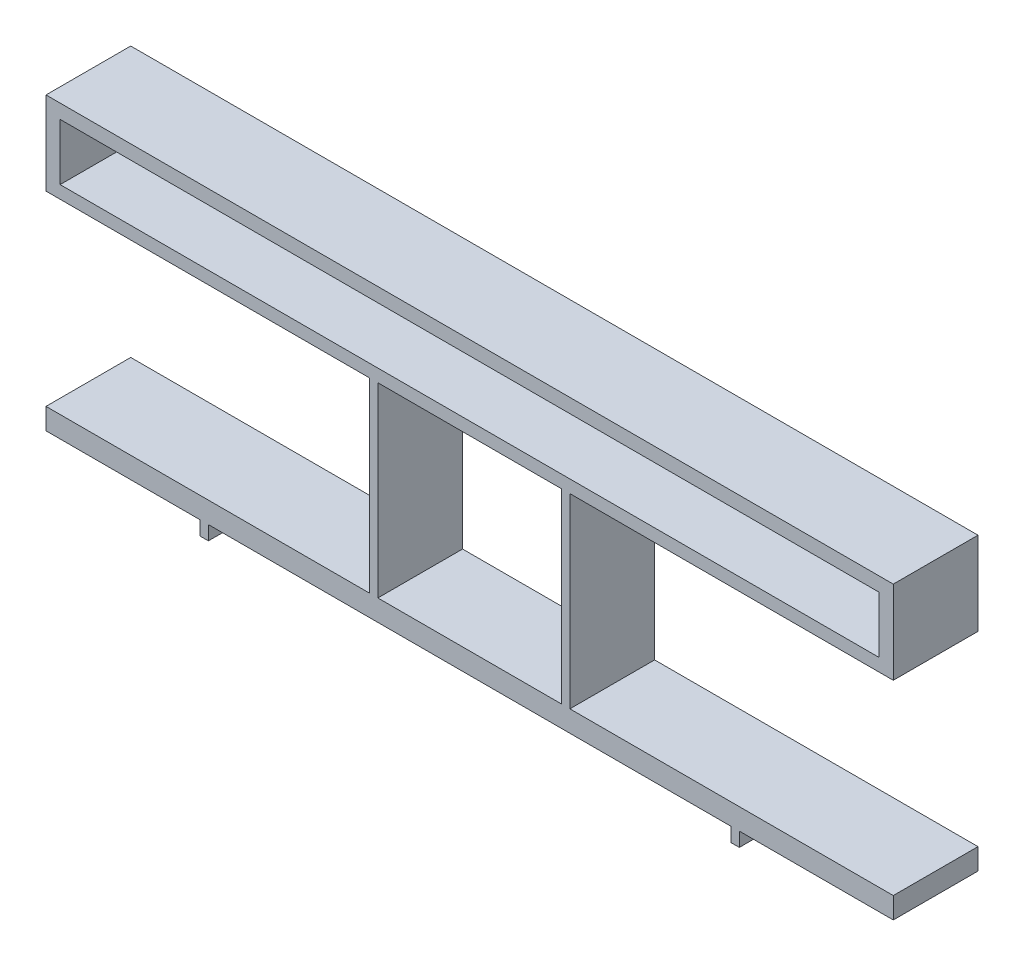
ISO-10303-21;
HEADER;
FILE_DESCRIPTION(('STEP AP214'),'2;1');
FILE_NAME('part.step','',(''),(''),'','','');
FILE_SCHEMA(('AUTOMOTIVE_DESIGN { 1 0 10303 214 1 1 1 1 }'));
ENDSEC;
DATA;
#1=APPLICATION_CONTEXT('core data for automotive mechanical design processes');
#2=APPLICATION_PROTOCOL_DEFINITION('international standard','automotive_design',2000,#1);
#3=PRODUCT_CONTEXT('',#1,'mechanical');
#4=PRODUCT('Part','Part','',(#3));
#5=PRODUCT_RELATED_PRODUCT_CATEGORY('part','',(#4));
#6=PRODUCT_DEFINITION_FORMATION('','',#4);
#7=PRODUCT_DEFINITION_CONTEXT('part definition',#1,'design');
#8=PRODUCT_DEFINITION('design','',#6,#7);
#9=PRODUCT_DEFINITION_SHAPE('','',#8);
#10=(LENGTH_UNIT() NAMED_UNIT(*) SI_UNIT(.MILLI.,.METRE.));
#11=(NAMED_UNIT(*) PLANE_ANGLE_UNIT() SI_UNIT($,.RADIAN.));
#12=(NAMED_UNIT(*) SI_UNIT($,.STERADIAN.) SOLID_ANGLE_UNIT());
#13=UNCERTAINTY_MEASURE_WITH_UNIT(LENGTH_MEASURE(1.E-05),#10,'distance_accuracy_value','');
#14=(GEOMETRIC_REPRESENTATION_CONTEXT(3) GLOBAL_UNCERTAINTY_ASSIGNED_CONTEXT((#13)) GLOBAL_UNIT_ASSIGNED_CONTEXT((#10,
#11,#12)) REPRESENTATION_CONTEXT('',''));
#15=CARTESIAN_POINT('',(0.,0.,0.));
#16=DIRECTION('',(0.,0.,1.));
#17=DIRECTION('',(1.,0.,0.));
#18=AXIS2_PLACEMENT_3D('',#15,#16,#17);
#19=CARTESIAN_POINT('',(-12.2386363636364,3.1875,30.));
#20=DIRECTION('',(0.,-1.,0.));
#21=DIRECTION('',(0.,0.,-1.));
#22=AXIS2_PLACEMENT_3D('',#19,#20,#21);
#23=PLANE('',#22);
#24=DIRECTION('',(0.,0.,1.));
#25=VECTOR('',#24,1.);
#26=CARTESIAN_POINT('',(102.261363636364,3.1875,0.));
#27=LINE('',#26,#25);
#28=CARTESIAN_POINT('',(102.261363636364,3.1875,0.));
#29=VERTEX_POINT('',#28);
#30=CARTESIAN_POINT('',(102.261363636364,3.1875,30.));
#31=VERTEX_POINT('',#30);
#32=EDGE_CURVE('E323',#29,#31,#27,.T.);
#33=ORIENTED_EDGE('',*,*,#32,.F.);
#34=DIRECTION('',(-1.,0.,0.));
#35=VECTOR('',#34,1.);
#36=CARTESIAN_POINT('',(-12.2386363636364,3.1875,0.));
#37=LINE('',#36,#35);
#38=CARTESIAN_POINT('',(-12.2386363636364,3.1875,0.));
#39=VERTEX_POINT('',#38);
#40=EDGE_CURVE('E494',#29,#39,#37,.T.);
#41=ORIENTED_EDGE('',*,*,#40,.T.);
#42=DIRECTION('',(0.,0.,-1.));
#43=VECTOR('',#42,1.);
#44=CARTESIAN_POINT('',(-12.2386363636364,3.1875,30.));
#45=LINE('',#44,#43);
#46=CARTESIAN_POINT('',(-12.2386363636364,3.1875,30.));
#47=VERTEX_POINT('',#46);
#48=EDGE_CURVE('E481',#47,#39,#45,.T.);
#49=ORIENTED_EDGE('',*,*,#48,.F.);
#50=DIRECTION('',(-1.,0.,0.));
#51=VECTOR('',#50,1.);
#52=CARTESIAN_POINT('',(-12.2386363636364,3.1875,30.));
#53=LINE('',#52,#51);
#54=EDGE_CURVE('E476',#31,#47,#53,.T.);
#55=ORIENTED_EDGE('',*,*,#54,.F.);
#56=EDGE_LOOP('',(#33,#41,#49,#55));
#57=FACE_BOUND('',#56,.T.);
#58=ADVANCED_FACE('F41',(#57),#23,.F.);
#59=DIRECTION('',(0.,0.,-1.));
#60=VECTOR('',#59,1.);
#61=CARTESIAN_POINT('',(105.261363636364,3.1875,0.));
#62=LINE('',#61,#60);
#63=CARTESIAN_POINT('',(105.261363636364,3.1875,30.));
#64=VERTEX_POINT('',#63);
#65=CARTESIAN_POINT('',(105.261363636364,3.1875,0.));
#66=VERTEX_POINT('',#65);
#67=EDGE_CURVE('E329',#64,#66,#62,.T.);
#68=ORIENTED_EDGE('',*,*,#67,.F.);
#69=CARTESIAN_POINT('',(170.261363636364,3.1875,30.));
#70=VERTEX_POINT('',#69);
#71=EDGE_CURVE('E482',#70,#64,#53,.T.);
#72=ORIENTED_EDGE('',*,*,#71,.F.);
#73=DIRECTION('',(0.,0.,1.));
#74=VECTOR('',#73,1.);
#75=CARTESIAN_POINT('',(170.261363636364,3.1875,0.));
#76=LINE('',#75,#74);
#77=CARTESIAN_POINT('',(170.261363636364,3.1875,0.));
#78=VERTEX_POINT('',#77);
#79=EDGE_CURVE('E355',#78,#70,#76,.T.);
#80=ORIENTED_EDGE('',*,*,#79,.F.);
#81=EDGE_CURVE('E497',#78,#66,#37,.T.);
#82=ORIENTED_EDGE('',*,*,#81,.T.);
#83=EDGE_LOOP('',(#68,#72,#80,#82));
#84=FACE_BOUND('',#83,.T.);
#85=ADVANCED_FACE('F554',(#84),#23,.F.);
#86=DIRECTION('',(0.,0.,-1.));
#87=VECTOR('',#86,1.);
#88=CARTESIAN_POINT('',(173.261363636364,3.1875,0.));
#89=LINE('',#88,#87);
#90=CARTESIAN_POINT('',(173.261363636364,3.1875,30.));
#91=VERTEX_POINT('',#90);
#92=CARTESIAN_POINT('',(173.261363636364,3.1875,0.));
#93=VERTEX_POINT('',#92);
#94=EDGE_CURVE('E361',#91,#93,#89,.T.);
#95=ORIENTED_EDGE('',*,*,#94,.F.);
#96=CARTESIAN_POINT('',(287.761363636364,3.1875,30.));
#97=VERTEX_POINT('',#96);
#98=EDGE_CURVE('E477',#97,#91,#53,.T.);
#99=ORIENTED_EDGE('',*,*,#98,.F.);
#100=DIRECTION('',(0.,0.,-1.));
#101=VECTOR('',#100,1.);
#102=CARTESIAN_POINT('',(287.761363636364,3.1875,30.));
#103=LINE('',#102,#101);
#104=CARTESIAN_POINT('',(287.761363636364,3.1875,0.));
#105=VERTEX_POINT('',#104);
#106=EDGE_CURVE('E501',#97,#105,#103,.T.);
#107=ORIENTED_EDGE('',*,*,#106,.T.);
#108=EDGE_CURVE('E467',#105,#93,#37,.T.);
#109=ORIENTED_EDGE('',*,*,#108,.T.);
#110=EDGE_LOOP('',(#95,#99,#107,#109));
#111=FACE_BOUND('',#110,.T.);
#112=ADVANCED_FACE('F520',(#111),#23,.F.);
#113=CARTESIAN_POINT('',(-12.2386363636364,-4.3125,30.));
#114=DIRECTION('',(0.,1.,0.));
#115=DIRECTION('',(0.,0.,1.));
#116=AXIS2_PLACEMENT_3D('',#113,#114,#115);
#117=PLANE('',#116);
#118=DIRECTION('',(0.,0.,1.));
#119=VECTOR('',#118,1.);
#120=CARTESIAN_POINT('',(45.2613636363636,-4.3125,0.));
#121=LINE('',#120,#119);
#122=CARTESIAN_POINT('',(45.2613636363636,-4.3125,0.));
#123=VERTEX_POINT('',#122);
#124=CARTESIAN_POINT('',(45.2613636363636,-4.3125,30.));
#125=VERTEX_POINT('',#124);
#126=EDGE_CURVE('E387',#123,#125,#121,.T.);
#127=ORIENTED_EDGE('',*,*,#126,.F.);
#128=DIRECTION('',(1.,0.,0.));
#129=VECTOR('',#128,1.);
#130=CARTESIAN_POINT('',(-12.2386363636364,-4.3125,0.));
#131=LINE('',#130,#129);
#132=CARTESIAN_POINT('',(230.261363636364,-4.3125,0.));
#133=VERTEX_POINT('',#132);
#134=EDGE_CURVE('E491',#123,#133,#131,.T.);
#135=ORIENTED_EDGE('',*,*,#134,.T.);
#136=DIRECTION('',(0.,0.,-1.));
#137=VECTOR('',#136,1.);
#138=CARTESIAN_POINT('',(230.261363636364,-4.3125,0.));
#139=LINE('',#138,#137);
#140=CARTESIAN_POINT('',(230.261363636364,-4.3125,30.));
#141=VERTEX_POINT('',#140);
#142=EDGE_CURVE('E430',#141,#133,#139,.T.);
#143=ORIENTED_EDGE('',*,*,#142,.F.);
#144=DIRECTION('',(1.,0.,0.));
#145=VECTOR('',#144,1.);
#146=CARTESIAN_POINT('',(-12.2386363636364,-4.3125,30.));
#147=LINE('',#146,#145);
#148=EDGE_CURVE('E473',#125,#141,#147,.T.);
#149=ORIENTED_EDGE('',*,*,#148,.F.);
#150=EDGE_LOOP('',(#127,#135,#143,#149));
#151=FACE_BOUND('',#150,.T.);
#152=ADVANCED_FACE('F537',(#151),#117,.F.);
#153=DIRECTION('',(0.,0.,-1.));
#154=VECTOR('',#153,1.);
#155=CARTESIAN_POINT('',(42.2613636363636,-4.3125,0.));
#156=LINE('',#155,#154);
#157=CARTESIAN_POINT('',(42.2613636363636,-4.3125,30.));
#158=VERTEX_POINT('',#157);
#159=CARTESIAN_POINT('',(42.2613636363636,-4.3125,0.));
#160=VERTEX_POINT('',#159);
#161=EDGE_CURVE('E393',#158,#160,#156,.T.);
#162=ORIENTED_EDGE('',*,*,#161,.F.);
#163=CARTESIAN_POINT('',(-12.2386363636364,-4.3125,30.));
#164=VERTEX_POINT('',#163);
#165=EDGE_CURVE('E468',#164,#158,#147,.T.);
#166=ORIENTED_EDGE('',*,*,#165,.F.);
#167=DIRECTION('',(0.,0.,-1.));
#168=VECTOR('',#167,1.);
#169=CARTESIAN_POINT('',(-12.2386363636364,-4.3125,30.));
#170=LINE('',#169,#168);
#171=CARTESIAN_POINT('',(-12.2386363636364,-4.3125,0.));
#172=VERTEX_POINT('',#171);
#173=EDGE_CURVE('E11',#164,#172,#170,.T.);
#174=ORIENTED_EDGE('',*,*,#173,.T.);
#175=EDGE_CURVE('E487',#172,#160,#131,.T.);
#176=ORIENTED_EDGE('',*,*,#175,.T.);
#177=EDGE_LOOP('',(#162,#166,#174,#176));
#178=FACE_BOUND('',#177,.T.);
#179=ADVANCED_FACE('F620',(#178),#117,.F.);
#180=DIRECTION('',(0.,0.,1.));
#181=VECTOR('',#180,1.);
#182=CARTESIAN_POINT('',(233.261363636364,-4.3125,0.));
#183=LINE('',#182,#181);
#184=CARTESIAN_POINT('',(233.261363636364,-4.3125,0.));
#185=VERTEX_POINT('',#184);
#186=CARTESIAN_POINT('',(233.261363636364,-4.3125,30.));
#187=VERTEX_POINT('',#186);
#188=EDGE_CURVE('E424',#185,#187,#183,.T.);
#189=ORIENTED_EDGE('',*,*,#188,.F.);
#190=CARTESIAN_POINT('',(287.761363636364,-4.3125,0.));
#191=VERTEX_POINT('',#190);
#192=EDGE_CURVE('E486',#185,#191,#131,.T.);
#193=ORIENTED_EDGE('',*,*,#192,.T.);
#194=DIRECTION('',(0.,0.,-1.));
#195=VECTOR('',#194,1.);
#196=CARTESIAN_POINT('',(287.761363636364,-4.3125,30.));
#197=LINE('',#196,#195);
#198=CARTESIAN_POINT('',(287.761363636364,-4.3125,30.));
#199=VERTEX_POINT('',#198);
#200=EDGE_CURVE('E50',#199,#191,#197,.T.);
#201=ORIENTED_EDGE('',*,*,#200,.F.);
#202=EDGE_CURVE('E466',#187,#199,#147,.T.);
#203=ORIENTED_EDGE('',*,*,#202,.F.);
#204=EDGE_LOOP('',(#189,#193,#201,#203));
#205=FACE_BOUND('',#204,.T.);
#206=ADVANCED_FACE('F547',(#205),#117,.F.);
#207=CARTESIAN_POINT('',(-12.2386363636364,3.1875,30.));
#208=DIRECTION('',(1.,0.,0.));
#209=DIRECTION('',(0.,0.,-1.));
#210=AXIS2_PLACEMENT_3D('',#207,#208,#209);
#211=PLANE('',#210);
#212=DIRECTION('',(0.,-1.,0.));
#213=VECTOR('',#212,1.);
#214=CARTESIAN_POINT('',(-12.2386363636364,3.1875,0.));
#215=LINE('',#214,#213);
#216=EDGE_CURVE('E461',#39,#172,#215,.T.);
#217=ORIENTED_EDGE('',*,*,#216,.T.);
#218=ORIENTED_EDGE('',*,*,#173,.F.);
#219=DIRECTION('',(0.,-1.,0.));
#220=VECTOR('',#219,1.);
#221=CARTESIAN_POINT('',(-12.2386363636364,3.1875,30.));
#222=LINE('',#221,#220);
#223=EDGE_CURVE('E462',#47,#164,#222,.T.);
#224=ORIENTED_EDGE('',*,*,#223,.F.);
#225=ORIENTED_EDGE('',*,*,#48,.T.);
#226=EDGE_LOOP('',(#217,#218,#224,#225));
#227=FACE_BOUND('',#226,.T.);
#228=ADVANCED_FACE('F43',(#227),#211,.F.);
#229=CARTESIAN_POINT('',(287.761363636364,3.1875,30.));
#230=DIRECTION('',(-1.,0.,0.));
#231=DIRECTION('',(0.,0.,1.));
#232=AXIS2_PLACEMENT_3D('',#229,#230,#231);
#233=PLANE('',#232);
#234=DIRECTION('',(0.,1.,0.));
#235=VECTOR('',#234,1.);
#236=CARTESIAN_POINT('',(287.761363636364,3.1875,0.));
#237=LINE('',#236,#235);
#238=EDGE_CURVE('E490',#191,#105,#237,.T.);
#239=ORIENTED_EDGE('',*,*,#238,.T.);
#240=ORIENTED_EDGE('',*,*,#106,.F.);
#241=DIRECTION('',(0.,1.,0.));
#242=VECTOR('',#241,1.);
#243=CARTESIAN_POINT('',(287.761363636364,3.1875,30.));
#244=LINE('',#243,#242);
#245=EDGE_CURVE('E472',#199,#97,#244,.T.);
#246=ORIENTED_EDGE('',*,*,#245,.F.);
#247=ORIENTED_EDGE('',*,*,#200,.T.);
#248=EDGE_LOOP('',(#239,#240,#246,#247));
#249=FACE_BOUND('',#248,.T.);
#250=ADVANCED_FACE('F510',(#249),#233,.F.);
#251=CARTESIAN_POINT('',(0.,0.,30.));
#252=DIRECTION('',(0.,0.,1.));
#253=DIRECTION('',(1.,0.,0.));
#254=AXIS2_PLACEMENT_3D('',#251,#252,#253);
#255=PLANE('',#254);
#256=DIRECTION('',(0.,-1.,0.));
#257=VECTOR('',#256,1.);
#258=CARTESIAN_POINT('',(282.761363636364,93.6875,30.));
#259=LINE('',#258,#257);
#260=CARTESIAN_POINT('',(282.761363636364,93.6875,30.));
#261=VERTEX_POINT('',#260);
#262=CARTESIAN_POINT('',(282.761363636364,73.6875,30.));
#263=VERTEX_POINT('',#262);
#264=EDGE_CURVE('E229',#261,#263,#259,.T.);
#265=ORIENTED_EDGE('',*,*,#264,.T.);
#266=DIRECTION('',(-1.,0.,0.));
#267=VECTOR('',#266,1.);
#268=CARTESIAN_POINT('',(282.761363636364,73.6875,30.));
#269=LINE('',#268,#267);
#270=CARTESIAN_POINT('',(-7.23863636363636,73.6875,30.));
#271=VERTEX_POINT('',#270);
#272=EDGE_CURVE('E239',#263,#271,#269,.T.);
#273=ORIENTED_EDGE('',*,*,#272,.T.);
#274=DIRECTION('',(0.,1.,0.));
#275=VECTOR('',#274,1.);
#276=CARTESIAN_POINT('',(-7.23863636363636,93.6875,30.));
#277=LINE('',#276,#275);
#278=CARTESIAN_POINT('',(-7.23863636363636,93.6875,30.));
#279=VERTEX_POINT('',#278);
#280=EDGE_CURVE('E57',#271,#279,#277,.T.);
#281=ORIENTED_EDGE('',*,*,#280,.T.);
#282=DIRECTION('',(1.,0.,0.));
#283=VECTOR('',#282,1.);
#284=CARTESIAN_POINT('',(282.761363636364,93.6875,30.));
#285=LINE('',#284,#283);
#286=EDGE_CURVE('E236',#279,#261,#285,.T.);
#287=ORIENTED_EDGE('',*,*,#286,.T.);
#288=EDGE_LOOP('',(#265,#273,#281,#287));
#289=FACE_BOUND('',#288,.T.);
#290=DIRECTION('',(0.,-1.,0.));
#291=VECTOR('',#290,1.);
#292=CARTESIAN_POINT('',(173.261363636364,69.1875,30.));
#293=LINE('',#292,#291);
#294=CARTESIAN_POINT('',(173.261363636364,69.1875,30.));
#295=VERTEX_POINT('',#294);
#296=EDGE_CURVE('E379',#295,#91,#293,.T.);
#297=ORIENTED_EDGE('',*,*,#296,.F.);
#298=DIRECTION('',(1.,0.,0.));
#299=VECTOR('',#298,1.);
#300=CARTESIAN_POINT('',(-12.2386363636364,69.1875,30.));
#301=LINE('',#300,#299);
#302=CARTESIAN_POINT('',(287.761363636364,69.1875,30.));
#303=VERTEX_POINT('',#302);
#304=EDGE_CURVE('E294',#295,#303,#301,.T.);
#305=ORIENTED_EDGE('',*,*,#304,.T.);
#306=DIRECTION('',(0.,-1.,0.));
#307=VECTOR('',#306,1.);
#308=CARTESIAN_POINT('',(287.761363636364,98.6875,30.));
#309=LINE('',#308,#307);
#310=CARTESIAN_POINT('',(287.761363636364,98.6875,30.));
#311=VERTEX_POINT('',#310);
#312=EDGE_CURVE('E315',#311,#303,#309,.T.);
#313=ORIENTED_EDGE('',*,*,#312,.F.);
#314=DIRECTION('',(1.,0.,0.));
#315=VECTOR('',#314,1.);
#316=CARTESIAN_POINT('',(-12.2386363636364,98.6875,30.));
#317=LINE('',#316,#315);
#318=CARTESIAN_POINT('',(-12.2386363636364,98.6875,30.));
#319=VERTEX_POINT('',#318);
#320=EDGE_CURVE('E280',#319,#311,#317,.T.);
#321=ORIENTED_EDGE('',*,*,#320,.F.);
#322=DIRECTION('',(0.,-1.,0.));
#323=VECTOR('',#322,1.);
#324=CARTESIAN_POINT('',(-12.2386363636364,98.6875,30.));
#325=LINE('',#324,#323);
#326=CARTESIAN_POINT('',(-12.2386363636364,69.1875,30.));
#327=VERTEX_POINT('',#326);
#328=EDGE_CURVE('E319',#319,#327,#325,.T.);
#329=ORIENTED_EDGE('',*,*,#328,.T.);
#330=CARTESIAN_POINT('',(102.261363636364,69.1875,30.));
#331=VERTEX_POINT('',#330);
#332=EDGE_CURVE('E295',#327,#331,#301,.T.);
#333=ORIENTED_EDGE('',*,*,#332,.T.);
#334=DIRECTION('',(0.,-1.,0.));
#335=VECTOR('',#334,1.);
#336=CARTESIAN_POINT('',(102.261363636364,69.1875,30.));
#337=LINE('',#336,#335);
#338=EDGE_CURVE('E351',#331,#31,#337,.T.);
#339=ORIENTED_EDGE('',*,*,#338,.T.);
#340=ORIENTED_EDGE('',*,*,#54,.T.);
#341=ORIENTED_EDGE('',*,*,#223,.T.);
#342=ORIENTED_EDGE('',*,*,#165,.T.);
#343=DIRECTION('',(0.,1.,0.));
#344=VECTOR('',#343,1.);
#345=CARTESIAN_POINT('',(42.2613636363636,-9.3125,30.));
#346=LINE('',#345,#344);
#347=CARTESIAN_POINT('',(42.2613636363636,-9.3125,30.));
#348=VERTEX_POINT('',#347);
#349=EDGE_CURVE('E416',#348,#158,#346,.T.);
#350=ORIENTED_EDGE('',*,*,#349,.F.);
#351=DIRECTION('',(-1.,0.,0.));
#352=VECTOR('',#351,1.);
#353=CARTESIAN_POINT('',(45.2613636363636,-9.3125,30.));
#354=LINE('',#353,#352);
#355=CARTESIAN_POINT('',(45.2613636363636,-9.3125,30.));
#356=VERTEX_POINT('',#355);
#357=EDGE_CURVE('E392',#356,#348,#354,.T.);
#358=ORIENTED_EDGE('',*,*,#357,.F.);
#359=DIRECTION('',(0.,1.,0.));
#360=VECTOR('',#359,1.);
#361=CARTESIAN_POINT('',(45.2613636363636,-9.3125,30.));
#362=LINE('',#361,#360);
#363=EDGE_CURVE('E420',#356,#125,#362,.T.);
#364=ORIENTED_EDGE('',*,*,#363,.T.);
#365=ORIENTED_EDGE('',*,*,#148,.T.);
#366=DIRECTION('',(0.,1.,0.));
#367=VECTOR('',#366,1.);
#368=CARTESIAN_POINT('',(230.261363636364,-9.3125,30.));
#369=LINE('',#368,#367);
#370=CARTESIAN_POINT('',(230.261363636364,-9.3125,30.));
#371=VERTEX_POINT('',#370);
#372=EDGE_CURVE('E453',#371,#141,#369,.T.);
#373=ORIENTED_EDGE('',*,*,#372,.F.);
#374=DIRECTION('',(-1.,0.,0.));
#375=VECTOR('',#374,1.);
#376=CARTESIAN_POINT('',(233.261363636364,-9.3125,30.));
#377=LINE('',#376,#375);
#378=CARTESIAN_POINT('',(233.261363636364,-9.3125,30.));
#379=VERTEX_POINT('',#378);
#380=EDGE_CURVE('E429',#379,#371,#377,.T.);
#381=ORIENTED_EDGE('',*,*,#380,.F.);
#382=DIRECTION('',(0.,1.,0.));
#383=VECTOR('',#382,1.);
#384=CARTESIAN_POINT('',(233.261363636364,-9.3125,30.));
#385=LINE('',#384,#383);
#386=EDGE_CURVE('E457',#379,#187,#385,.T.);
#387=ORIENTED_EDGE('',*,*,#386,.T.);
#388=ORIENTED_EDGE('',*,*,#202,.T.);
#389=ORIENTED_EDGE('',*,*,#245,.T.);
#390=ORIENTED_EDGE('',*,*,#98,.T.);
#391=EDGE_LOOP('',(#297,#305,#313,#321,#329,#333,#339,#340,#341,#342,#350,#358,#364,#365,#373,
#381,#387,#388,#389,#390));
#392=FACE_BOUND('',#391,.T.);
#393=CARTESIAN_POINT('',(105.261363636364,69.1875,30.));
#394=VERTEX_POINT('',#393);
#395=CARTESIAN_POINT('',(170.261363636364,69.1875,30.));
#396=VERTEX_POINT('',#395);
#397=EDGE_CURVE('E300',#394,#396,#301,.T.);
#398=ORIENTED_EDGE('',*,*,#397,.T.);
#399=DIRECTION('',(0.,-1.,0.));
#400=VECTOR('',#399,1.);
#401=CARTESIAN_POINT('',(170.261363636364,69.1875,30.));
#402=LINE('',#401,#400);
#403=EDGE_CURVE('E383',#396,#70,#402,.T.);
#404=ORIENTED_EDGE('',*,*,#403,.T.);
#405=ORIENTED_EDGE('',*,*,#71,.T.);
#406=DIRECTION('',(0.,-1.,0.));
#407=VECTOR('',#406,1.);
#408=CARTESIAN_POINT('',(105.261363636364,69.1875,30.));
#409=LINE('',#408,#407);
#410=EDGE_CURVE('E347',#394,#64,#409,.T.);
#411=ORIENTED_EDGE('',*,*,#410,.F.);
#412=EDGE_LOOP('',(#398,#404,#405,#411));
#413=FACE_BOUND('',#412,.T.);
#414=ADVANCED_FACE('F244',(#289,#392,#413),#255,.T.);
#415=CARTESIAN_POINT('',(0.,0.,0.));
#416=DIRECTION('',(0.,0.,1.));
#417=DIRECTION('',(1.,0.,0.));
#418=AXIS2_PLACEMENT_3D('',#415,#416,#417);
#419=PLANE('',#418);
#420=DIRECTION('',(-1.,0.,0.));
#421=VECTOR('',#420,1.);
#422=CARTESIAN_POINT('',(282.761363636364,73.6875,0.));
#423=LINE('',#422,#421);
#424=CARTESIAN_POINT('',(282.761363636364,73.6875,0.));
#425=VERTEX_POINT('',#424);
#426=CARTESIAN_POINT('',(-7.23863636363636,73.6875,0.));
#427=VERTEX_POINT('',#426);
#428=EDGE_CURVE('E261',#425,#427,#423,.T.);
#429=ORIENTED_EDGE('',*,*,#428,.F.);
#430=DIRECTION('',(0.,-1.,0.));
#431=VECTOR('',#430,1.);
#432=CARTESIAN_POINT('',(282.761363636364,93.6875,0.));
#433=LINE('',#432,#431);
#434=CARTESIAN_POINT('',(282.761363636364,93.6875,0.));
#435=VERTEX_POINT('',#434);
#436=EDGE_CURVE('E65',#435,#425,#433,.T.);
#437=ORIENTED_EDGE('',*,*,#436,.F.);
#438=DIRECTION('',(1.,0.,0.));
#439=VECTOR('',#438,1.);
#440=CARTESIAN_POINT('',(282.761363636364,93.6875,0.));
#441=LINE('',#440,#439);
#442=CARTESIAN_POINT('',(-7.23863636363636,93.6875,0.));
#443=VERTEX_POINT('',#442);
#444=EDGE_CURVE('E248',#443,#435,#441,.T.);
#445=ORIENTED_EDGE('',*,*,#444,.F.);
#446=DIRECTION('',(0.,1.,0.));
#447=VECTOR('',#446,1.);
#448=CARTESIAN_POINT('',(-7.23863636363636,93.6875,0.));
#449=LINE('',#448,#447);
#450=EDGE_CURVE('E252',#427,#443,#449,.T.);
#451=ORIENTED_EDGE('',*,*,#450,.F.);
#452=EDGE_LOOP('',(#429,#437,#445,#451));
#453=FACE_BOUND('',#452,.T.);
#454=DIRECTION('',(0.,-1.,0.));
#455=VECTOR('',#454,1.);
#456=CARTESIAN_POINT('',(170.261363636364,69.1875,0.));
#457=LINE('',#456,#455);
#458=CARTESIAN_POINT('',(170.261363636364,69.1875,0.));
#459=VERTEX_POINT('',#458);
#460=EDGE_CURVE('E365',#459,#78,#457,.T.);
#461=ORIENTED_EDGE('',*,*,#460,.F.);
#462=DIRECTION('',(-1.,0.,0.));
#463=VECTOR('',#462,1.);
#464=CARTESIAN_POINT('',(-12.2386363636364,69.1875,0.));
#465=LINE('',#464,#463);
#466=CARTESIAN_POINT('',(105.261363636364,69.1875,0.));
#467=VERTEX_POINT('',#466);
#468=EDGE_CURVE('E307',#459,#467,#465,.T.);
#469=ORIENTED_EDGE('',*,*,#468,.T.);
#470=DIRECTION('',(0.,-1.,0.));
#471=VECTOR('',#470,1.);
#472=CARTESIAN_POINT('',(105.261363636364,69.1875,0.));
#473=LINE('',#472,#471);
#474=EDGE_CURVE('E343',#467,#66,#473,.T.);
#475=ORIENTED_EDGE('',*,*,#474,.T.);
#476=ORIENTED_EDGE('',*,*,#81,.F.);
#477=EDGE_LOOP('',(#461,#469,#475,#476));
#478=FACE_BOUND('',#477,.T.);
#479=ORIENTED_EDGE('',*,*,#216,.F.);
#480=ORIENTED_EDGE('',*,*,#40,.F.);
#481=DIRECTION('',(0.,-1.,0.));
#482=VECTOR('',#481,1.);
#483=CARTESIAN_POINT('',(102.261363636364,69.1875,0.));
#484=LINE('',#483,#482);
#485=CARTESIAN_POINT('',(102.261363636364,69.1875,0.));
#486=VERTEX_POINT('',#485);
#487=EDGE_CURVE('E333',#486,#29,#484,.T.);
#488=ORIENTED_EDGE('',*,*,#487,.F.);
#489=CARTESIAN_POINT('',(-12.2386363636364,69.1875,0.));
#490=VERTEX_POINT('',#489);
#491=EDGE_CURVE('E303',#486,#490,#465,.T.);
#492=ORIENTED_EDGE('',*,*,#491,.T.);
#493=DIRECTION('',(0.,-1.,0.));
#494=VECTOR('',#493,1.);
#495=CARTESIAN_POINT('',(-12.2386363636364,98.6875,0.));
#496=LINE('',#495,#494);
#497=CARTESIAN_POINT('',(-12.2386363636364,98.6875,0.));
#498=VERTEX_POINT('',#497);
#499=EDGE_CURVE('E290',#498,#490,#496,.T.);
#500=ORIENTED_EDGE('',*,*,#499,.F.);
#501=DIRECTION('',(-1.,0.,0.));
#502=VECTOR('',#501,1.);
#503=CARTESIAN_POINT('',(-12.2386363636364,98.6875,0.));
#504=LINE('',#503,#502);
#505=CARTESIAN_POINT('',(287.761363636364,98.6875,0.));
#506=VERTEX_POINT('',#505);
#507=EDGE_CURVE('E287',#506,#498,#504,.T.);
#508=ORIENTED_EDGE('',*,*,#507,.F.);
#509=DIRECTION('',(0.,-1.,0.));
#510=VECTOR('',#509,1.);
#511=CARTESIAN_POINT('',(287.761363636364,98.6875,0.));
#512=LINE('',#511,#510);
#513=CARTESIAN_POINT('',(287.761363636364,69.1875,0.));
#514=VERTEX_POINT('',#513);
#515=EDGE_CURVE('E311',#506,#514,#512,.T.);
#516=ORIENTED_EDGE('',*,*,#515,.T.);
#517=CARTESIAN_POINT('',(173.261363636364,69.1875,0.));
#518=VERTEX_POINT('',#517);
#519=EDGE_CURVE('E281',#514,#518,#465,.T.);
#520=ORIENTED_EDGE('',*,*,#519,.T.);
#521=DIRECTION('',(0.,-1.,0.));
#522=VECTOR('',#521,1.);
#523=CARTESIAN_POINT('',(173.261363636364,69.1875,0.));
#524=LINE('',#523,#522);
#525=EDGE_CURVE('E375',#518,#93,#524,.T.);
#526=ORIENTED_EDGE('',*,*,#525,.T.);
#527=ORIENTED_EDGE('',*,*,#108,.F.);
#528=ORIENTED_EDGE('',*,*,#238,.F.);
#529=ORIENTED_EDGE('',*,*,#192,.F.);
#530=DIRECTION('',(0.,1.,0.));
#531=VECTOR('',#530,1.);
#532=CARTESIAN_POINT('',(233.261363636364,-9.3125,0.));
#533=LINE('',#532,#531);
#534=CARTESIAN_POINT('',(233.261363636364,-9.3125,0.));
#535=VERTEX_POINT('',#534);
#536=EDGE_CURVE('E439',#535,#185,#533,.T.);
#537=ORIENTED_EDGE('',*,*,#536,.F.);
#538=DIRECTION('',(1.,0.,0.));
#539=VECTOR('',#538,1.);
#540=CARTESIAN_POINT('',(233.261363636364,-9.3125,0.));
#541=LINE('',#540,#539);
#542=CARTESIAN_POINT('',(230.261363636364,-9.3125,0.));
#543=VERTEX_POINT('',#542);
#544=EDGE_CURVE('E436',#543,#535,#541,.T.);
#545=ORIENTED_EDGE('',*,*,#544,.F.);
#546=DIRECTION('',(0.,1.,0.));
#547=VECTOR('',#546,1.);
#548=CARTESIAN_POINT('',(230.261363636364,-9.3125,0.));
#549=LINE('',#548,#547);
#550=EDGE_CURVE('E449',#543,#133,#549,.T.);
#551=ORIENTED_EDGE('',*,*,#550,.T.);
#552=ORIENTED_EDGE('',*,*,#134,.F.);
#553=DIRECTION('',(0.,1.,0.));
#554=VECTOR('',#553,1.);
#555=CARTESIAN_POINT('',(45.2613636363636,-9.3125,0.));
#556=LINE('',#555,#554);
#557=CARTESIAN_POINT('',(45.2613636363636,-9.3125,0.));
#558=VERTEX_POINT('',#557);
#559=EDGE_CURVE('E402',#558,#123,#556,.T.);
#560=ORIENTED_EDGE('',*,*,#559,.F.);
#561=DIRECTION('',(1.,0.,0.));
#562=VECTOR('',#561,1.);
#563=CARTESIAN_POINT('',(45.2613636363636,-9.3125,0.));
#564=LINE('',#563,#562);
#565=CARTESIAN_POINT('',(42.2613636363636,-9.3125,0.));
#566=VERTEX_POINT('',#565);
#567=EDGE_CURVE('E399',#566,#558,#564,.T.);
#568=ORIENTED_EDGE('',*,*,#567,.F.);
#569=DIRECTION('',(0.,1.,0.));
#570=VECTOR('',#569,1.);
#571=CARTESIAN_POINT('',(42.2613636363636,-9.3125,0.));
#572=LINE('',#571,#570);
#573=EDGE_CURVE('E412',#566,#160,#572,.T.);
#574=ORIENTED_EDGE('',*,*,#573,.T.);
#575=ORIENTED_EDGE('',*,*,#175,.F.);
#576=EDGE_LOOP('',(#479,#480,#488,#492,#500,#508,#516,#520,#526,#527,#528,#529,#537,#545,#551,
#552,#560,#568,#574,#575));
#577=FACE_BOUND('',#576,.T.);
#578=ADVANCED_FACE('F517',(#453,#478,#577),#419,.F.);
#579=CARTESIAN_POINT('',(233.261363636364,-9.3125,0.));
#580=DIRECTION('',(-1.,0.,0.));
#581=DIRECTION('',(0.,0.,1.));
#582=AXIS2_PLACEMENT_3D('',#579,#580,#581);
#583=PLANE('',#582);
#584=ORIENTED_EDGE('',*,*,#188,.T.);
#585=ORIENTED_EDGE('',*,*,#386,.F.);
#586=DIRECTION('',(0.,0.,1.));
#587=VECTOR('',#586,1.);
#588=CARTESIAN_POINT('',(233.261363636364,-9.3125,0.));
#589=LINE('',#588,#587);
#590=EDGE_CURVE('E425',#535,#379,#589,.T.);
#591=ORIENTED_EDGE('',*,*,#590,.F.);
#592=ORIENTED_EDGE('',*,*,#536,.T.);
#593=EDGE_LOOP('',(#584,#585,#591,#592));
#594=FACE_BOUND('',#593,.T.);
#595=ADVANCED_FACE('F546',(#594),#583,.F.);
#596=CARTESIAN_POINT('',(230.261363636364,-9.3125,0.));
#597=DIRECTION('',(1.,0.,0.));
#598=DIRECTION('',(0.,0.,-1.));
#599=AXIS2_PLACEMENT_3D('',#596,#597,#598);
#600=PLANE('',#599);
#601=ORIENTED_EDGE('',*,*,#142,.T.);
#602=ORIENTED_EDGE('',*,*,#550,.F.);
#603=DIRECTION('',(0.,0.,-1.));
#604=VECTOR('',#603,1.);
#605=CARTESIAN_POINT('',(230.261363636364,-9.3125,0.));
#606=LINE('',#605,#604);
#607=EDGE_CURVE('E433',#371,#543,#606,.T.);
#608=ORIENTED_EDGE('',*,*,#607,.F.);
#609=ORIENTED_EDGE('',*,*,#372,.T.);
#610=EDGE_LOOP('',(#601,#602,#608,#609));
#611=FACE_BOUND('',#610,.T.);
#612=ADVANCED_FACE('F540',(#611),#600,.F.);
#613=CARTESIAN_POINT('',(0.,-9.3125,0.));
#614=DIRECTION('',(0.,-1.,0.));
#615=DIRECTION('',(0.,0.,-1.));
#616=AXIS2_PLACEMENT_3D('',#613,#614,#615);
#617=PLANE('',#616);
#618=ORIENTED_EDGE('',*,*,#590,.T.);
#619=ORIENTED_EDGE('',*,*,#380,.T.);
#620=ORIENTED_EDGE('',*,*,#607,.T.);
#621=ORIENTED_EDGE('',*,*,#544,.T.);
#622=EDGE_LOOP('',(#618,#619,#620,#621));
#623=FACE_BOUND('',#622,.T.);
#624=ADVANCED_FACE('F543',(#623),#617,.T.);
#625=CARTESIAN_POINT('',(45.2613636363636,-9.3125,0.));
#626=DIRECTION('',(-1.,0.,0.));
#627=DIRECTION('',(0.,0.,1.));
#628=AXIS2_PLACEMENT_3D('',#625,#626,#627);
#629=PLANE('',#628);
#630=ORIENTED_EDGE('',*,*,#126,.T.);
#631=ORIENTED_EDGE('',*,*,#363,.F.);
#632=DIRECTION('',(0.,0.,1.));
#633=VECTOR('',#632,1.);
#634=CARTESIAN_POINT('',(45.2613636363636,-9.3125,0.));
#635=LINE('',#634,#633);
#636=EDGE_CURVE('E388',#558,#356,#635,.T.);
#637=ORIENTED_EDGE('',*,*,#636,.F.);
#638=ORIENTED_EDGE('',*,*,#559,.T.);
#639=EDGE_LOOP('',(#630,#631,#637,#638));
#640=FACE_BOUND('',#639,.T.);
#641=ADVANCED_FACE('F683',(#640),#629,.F.);
#642=CARTESIAN_POINT('',(42.2613636363636,-9.3125,0.));
#643=DIRECTION('',(1.,0.,0.));
#644=DIRECTION('',(0.,0.,-1.));
#645=AXIS2_PLACEMENT_3D('',#642,#643,#644);
#646=PLANE('',#645);
#647=ORIENTED_EDGE('',*,*,#161,.T.);
#648=ORIENTED_EDGE('',*,*,#573,.F.);
#649=DIRECTION('',(0.,0.,-1.));
#650=VECTOR('',#649,1.);
#651=CARTESIAN_POINT('',(42.2613636363636,-9.3125,0.));
#652=LINE('',#651,#650);
#653=EDGE_CURVE('E396',#348,#566,#652,.T.);
#654=ORIENTED_EDGE('',*,*,#653,.F.);
#655=ORIENTED_EDGE('',*,*,#349,.T.);
#656=EDGE_LOOP('',(#647,#648,#654,#655));
#657=FACE_BOUND('',#656,.T.);
#658=ADVANCED_FACE('F603',(#657),#646,.F.);
#659=CARTESIAN_POINT('',(0.,-9.3125,0.));
#660=DIRECTION('',(0.,-1.,0.));
#661=DIRECTION('',(0.,0.,-1.));
#662=AXIS2_PLACEMENT_3D('',#659,#660,#661);
#663=PLANE('',#662);
#664=ORIENTED_EDGE('',*,*,#636,.T.);
#665=ORIENTED_EDGE('',*,*,#357,.T.);
#666=ORIENTED_EDGE('',*,*,#653,.T.);
#667=ORIENTED_EDGE('',*,*,#567,.T.);
#668=EDGE_LOOP('',(#664,#665,#666,#667));
#669=FACE_BOUND('',#668,.T.);
#670=ADVANCED_FACE('F594',(#669),#663,.T.);
#671=CARTESIAN_POINT('',(170.261363636364,69.1875,0.));
#672=DIRECTION('',(1.,0.,0.));
#673=DIRECTION('',(0.,0.,-1.));
#674=AXIS2_PLACEMENT_3D('',#671,#672,#673);
#675=PLANE('',#674);
#676=ORIENTED_EDGE('',*,*,#79,.T.);
#677=ORIENTED_EDGE('',*,*,#403,.F.);
#678=DIRECTION('',(0.,0.,1.));
#679=VECTOR('',#678,1.);
#680=CARTESIAN_POINT('',(170.261363636364,69.1875,0.));
#681=LINE('',#680,#679);
#682=EDGE_CURVE('E356',#459,#396,#681,.T.);
#683=ORIENTED_EDGE('',*,*,#682,.F.);
#684=ORIENTED_EDGE('',*,*,#460,.T.);
#685=EDGE_LOOP('',(#676,#677,#683,#684));
#686=FACE_BOUND('',#685,.T.);
#687=ADVANCED_FACE('F592',(#686),#675,.F.);
#688=CARTESIAN_POINT('',(173.261363636364,69.1875,0.));
#689=DIRECTION('',(-1.,0.,0.));
#690=DIRECTION('',(0.,0.,1.));
#691=AXIS2_PLACEMENT_3D('',#688,#689,#690);
#692=PLANE('',#691);
#693=ORIENTED_EDGE('',*,*,#94,.T.);
#694=ORIENTED_EDGE('',*,*,#525,.F.);
#695=DIRECTION('',(0.,0.,-1.));
#696=VECTOR('',#695,1.);
#697=CARTESIAN_POINT('',(173.261363636364,69.1875,0.));
#698=LINE('',#697,#696);
#699=EDGE_CURVE('E360',#295,#518,#698,.T.);
#700=ORIENTED_EDGE('',*,*,#699,.F.);
#701=ORIENTED_EDGE('',*,*,#296,.T.);
#702=EDGE_LOOP('',(#693,#694,#700,#701));
#703=FACE_BOUND('',#702,.T.);
#704=ADVANCED_FACE('F523',(#703),#692,.F.);
#705=CARTESIAN_POINT('',(102.261363636364,69.1875,0.));
#706=DIRECTION('',(1.,0.,0.));
#707=DIRECTION('',(0.,0.,-1.));
#708=AXIS2_PLACEMENT_3D('',#705,#706,#707);
#709=PLANE('',#708);
#710=ORIENTED_EDGE('',*,*,#32,.T.);
#711=ORIENTED_EDGE('',*,*,#338,.F.);
#712=DIRECTION('',(0.,0.,1.));
#713=VECTOR('',#712,1.);
#714=CARTESIAN_POINT('',(102.261363636364,69.1875,0.));
#715=LINE('',#714,#713);
#716=EDGE_CURVE('E324',#486,#331,#715,.T.);
#717=ORIENTED_EDGE('',*,*,#716,.F.);
#718=ORIENTED_EDGE('',*,*,#487,.T.);
#719=EDGE_LOOP('',(#710,#711,#717,#718));
#720=FACE_BOUND('',#719,.T.);
#721=ADVANCED_FACE('F600',(#720),#709,.F.);
#722=CARTESIAN_POINT('',(105.261363636364,69.1875,0.));
#723=DIRECTION('',(-1.,0.,0.));
#724=DIRECTION('',(0.,0.,1.));
#725=AXIS2_PLACEMENT_3D('',#722,#723,#724);
#726=PLANE('',#725);
#727=ORIENTED_EDGE('',*,*,#67,.T.);
#728=ORIENTED_EDGE('',*,*,#474,.F.);
#729=DIRECTION('',(0.,0.,-1.));
#730=VECTOR('',#729,1.);
#731=CARTESIAN_POINT('',(105.261363636364,69.1875,0.));
#732=LINE('',#731,#730);
#733=EDGE_CURVE('E328',#394,#467,#732,.T.);
#734=ORIENTED_EDGE('',*,*,#733,.F.);
#735=ORIENTED_EDGE('',*,*,#410,.T.);
#736=EDGE_LOOP('',(#727,#728,#734,#735));
#737=FACE_BOUND('',#736,.T.);
#738=ADVANCED_FACE('F559',(#737),#726,.F.);
#739=CARTESIAN_POINT('',(0.,69.1875,0.));
#740=DIRECTION('',(0.,1.,0.));
#741=DIRECTION('',(0.,0.,1.));
#742=AXIS2_PLACEMENT_3D('',#739,#740,#741);
#743=PLANE('',#742);
#744=ORIENTED_EDGE('',*,*,#468,.F.);
#745=ORIENTED_EDGE('',*,*,#682,.T.);
#746=ORIENTED_EDGE('',*,*,#397,.F.);
#747=ORIENTED_EDGE('',*,*,#733,.T.);
#748=EDGE_LOOP('',(#744,#745,#746,#747));
#749=FACE_BOUND('',#748,.T.);
#750=ADVANCED_FACE('F590',(#749),#743,.F.);
#751=ORIENTED_EDGE('',*,*,#304,.F.);
#752=ORIENTED_EDGE('',*,*,#699,.T.);
#753=ORIENTED_EDGE('',*,*,#519,.F.);
#754=DIRECTION('',(0.,0.,-1.));
#755=VECTOR('',#754,1.);
#756=CARTESIAN_POINT('',(287.761363636364,69.1875,0.));
#757=LINE('',#756,#755);
#758=EDGE_CURVE('E299',#303,#514,#757,.T.);
#759=ORIENTED_EDGE('',*,*,#758,.F.);
#760=EDGE_LOOP('',(#751,#752,#753,#759));
#761=FACE_BOUND('',#760,.T.);
#762=ADVANCED_FACE('F585',(#761),#743,.F.);
#763=ORIENTED_EDGE('',*,*,#491,.F.);
#764=ORIENTED_EDGE('',*,*,#716,.T.);
#765=ORIENTED_EDGE('',*,*,#332,.F.);
#766=DIRECTION('',(0.,0.,1.));
#767=VECTOR('',#766,1.);
#768=CARTESIAN_POINT('',(-12.2386363636364,69.1875,0.));
#769=LINE('',#768,#767);
#770=EDGE_CURVE('E270',#490,#327,#769,.T.);
#771=ORIENTED_EDGE('',*,*,#770,.F.);
#772=EDGE_LOOP('',(#763,#764,#765,#771));
#773=FACE_BOUND('',#772,.T.);
#774=ADVANCED_FACE('F576',(#773),#743,.F.);
#775=CARTESIAN_POINT('',(-12.2386363636364,98.6875,0.));
#776=DIRECTION('',(1.,0.,0.));
#777=DIRECTION('',(0.,0.,-1.));
#778=AXIS2_PLACEMENT_3D('',#775,#776,#777);
#779=PLANE('',#778);
#780=ORIENTED_EDGE('',*,*,#770,.T.);
#781=ORIENTED_EDGE('',*,*,#328,.F.);
#782=DIRECTION('',(0.,0.,1.));
#783=VECTOR('',#782,1.);
#784=CARTESIAN_POINT('',(-12.2386363636364,98.6875,0.));
#785=LINE('',#784,#783);
#786=EDGE_CURVE('E276',#498,#319,#785,.T.);
#787=ORIENTED_EDGE('',*,*,#786,.F.);
#788=ORIENTED_EDGE('',*,*,#499,.T.);
#789=EDGE_LOOP('',(#780,#781,#787,#788));
#790=FACE_BOUND('',#789,.T.);
#791=ADVANCED_FACE('F574',(#790),#779,.F.);
#792=CARTESIAN_POINT('',(287.761363636364,98.6875,0.));
#793=DIRECTION('',(-1.,0.,0.));
#794=DIRECTION('',(0.,0.,1.));
#795=AXIS2_PLACEMENT_3D('',#792,#793,#794);
#796=PLANE('',#795);
#797=ORIENTED_EDGE('',*,*,#758,.T.);
#798=ORIENTED_EDGE('',*,*,#515,.F.);
#799=DIRECTION('',(0.,0.,-1.));
#800=VECTOR('',#799,1.);
#801=CARTESIAN_POINT('',(287.761363636364,98.6875,0.));
#802=LINE('',#801,#800);
#803=EDGE_CURVE('E284',#311,#506,#802,.T.);
#804=ORIENTED_EDGE('',*,*,#803,.F.);
#805=ORIENTED_EDGE('',*,*,#312,.T.);
#806=EDGE_LOOP('',(#797,#798,#804,#805));
#807=FACE_BOUND('',#806,.T.);
#808=ADVANCED_FACE('F650',(#807),#796,.F.);
#809=CARTESIAN_POINT('',(0.,98.6875,0.));
#810=DIRECTION('',(0.,1.,0.));
#811=DIRECTION('',(0.,0.,1.));
#812=AXIS2_PLACEMENT_3D('',#809,#810,#811);
#813=PLANE('',#812);
#814=ORIENTED_EDGE('',*,*,#786,.T.);
#815=ORIENTED_EDGE('',*,*,#320,.T.);
#816=ORIENTED_EDGE('',*,*,#803,.T.);
#817=ORIENTED_EDGE('',*,*,#507,.T.);
#818=EDGE_LOOP('',(#814,#815,#816,#817));
#819=FACE_BOUND('',#818,.T.);
#820=ADVANCED_FACE('F579',(#819),#813,.T.);
#821=CARTESIAN_POINT('',(282.761363636364,93.6875,30.));
#822=DIRECTION('',(1.,0.,0.));
#823=DIRECTION('',(0.,0.,-1.));
#824=AXIS2_PLACEMENT_3D('',#821,#822,#823);
#825=PLANE('',#824);
#826=ORIENTED_EDGE('',*,*,#436,.T.);
#827=DIRECTION('',(0.,0.,-1.));
#828=VECTOR('',#827,1.);
#829=CARTESIAN_POINT('',(282.761363636364,73.6875,30.));
#830=LINE('',#829,#828);
#831=EDGE_CURVE('E225',#263,#425,#830,.T.);
#832=ORIENTED_EDGE('',*,*,#831,.F.);
#833=ORIENTED_EDGE('',*,*,#264,.F.);
#834=DIRECTION('',(0.,0.,-1.));
#835=VECTOR('',#834,1.);
#836=CARTESIAN_POINT('',(282.761363636364,93.6875,30.));
#837=LINE('',#836,#835);
#838=EDGE_CURVE('E267',#261,#435,#837,.T.);
#839=ORIENTED_EDGE('',*,*,#838,.T.);
#840=EDGE_LOOP('',(#826,#832,#833,#839));
#841=FACE_BOUND('',#840,.T.);
#842=ADVANCED_FACE('F227',(#841),#825,.F.);
#843=CARTESIAN_POINT('',(282.761363636364,93.6875,30.));
#844=DIRECTION('',(0.,1.,0.));
#845=DIRECTION('',(0.,0.,1.));
#846=AXIS2_PLACEMENT_3D('',#843,#844,#845);
#847=PLANE('',#846);
#848=ORIENTED_EDGE('',*,*,#444,.T.);
#849=ORIENTED_EDGE('',*,*,#838,.F.);
#850=ORIENTED_EDGE('',*,*,#286,.F.);
#851=DIRECTION('',(0.,0.,-1.));
#852=VECTOR('',#851,1.);
#853=CARTESIAN_POINT('',(-7.23863636363636,93.6875,30.));
#854=LINE('',#853,#852);
#855=EDGE_CURVE('E271',#279,#443,#854,.T.);
#856=ORIENTED_EDGE('',*,*,#855,.T.);
#857=EDGE_LOOP('',(#848,#849,#850,#856));
#858=FACE_BOUND('',#857,.T.);
#859=ADVANCED_FACE('F659',(#858),#847,.F.);
#860=CARTESIAN_POINT('',(-7.23863636363636,93.6875,30.));
#861=DIRECTION('',(-1.,0.,0.));
#862=DIRECTION('',(0.,0.,1.));
#863=AXIS2_PLACEMENT_3D('',#860,#861,#862);
#864=PLANE('',#863);
#865=ORIENTED_EDGE('',*,*,#450,.T.);
#866=ORIENTED_EDGE('',*,*,#855,.F.);
#867=ORIENTED_EDGE('',*,*,#280,.F.);
#868=DIRECTION('',(0.,0.,-1.));
#869=VECTOR('',#868,1.);
#870=CARTESIAN_POINT('',(-7.23863636363636,73.6875,30.));
#871=LINE('',#870,#869);
#872=EDGE_CURVE('E235',#271,#427,#871,.T.);
#873=ORIENTED_EDGE('',*,*,#872,.T.);
#874=EDGE_LOOP('',(#865,#866,#867,#873));
#875=FACE_BOUND('',#874,.T.);
#876=ADVANCED_FACE('F662',(#875),#864,.F.);
#877=CARTESIAN_POINT('',(282.761363636364,73.6875,30.));
#878=DIRECTION('',(0.,-1.,0.));
#879=DIRECTION('',(0.,0.,-1.));
#880=AXIS2_PLACEMENT_3D('',#877,#878,#879);
#881=PLANE('',#880);
#882=ORIENTED_EDGE('',*,*,#428,.T.);
#883=ORIENTED_EDGE('',*,*,#872,.F.);
#884=ORIENTED_EDGE('',*,*,#272,.F.);
#885=ORIENTED_EDGE('',*,*,#831,.T.);
#886=EDGE_LOOP('',(#882,#883,#884,#885));
#887=FACE_BOUND('',#886,.T.);
#888=ADVANCED_FACE('F240',(#887),#881,.F.);
#889=CLOSED_SHELL('',(#58,#85,#112,#152,#179,#206,#228,#250,#414,#578,#595,#612,#624,#641,#658,
#670,#687,#704,#721,#738,#750,#762,#774,#791,#808,#820,#842,#859,#876,#888));
#890=MANIFOLD_SOLID_BREP('B2',#889);
#891=ADVANCED_BREP_SHAPE_REPRESENTATION('',(#18,#890),#14);
#892=SHAPE_DEFINITION_REPRESENTATION(#9,#891);
ENDSEC;
END-ISO-10303-21;
